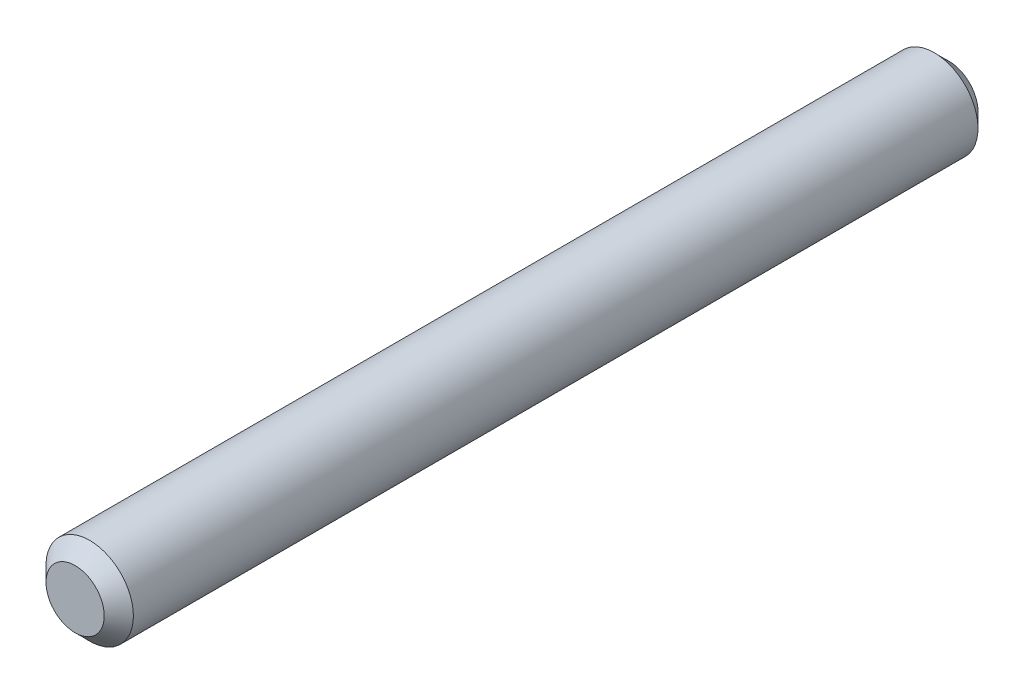
ISO-10303-21;
HEADER;
FILE_DESCRIPTION(('STEP AP214'),'2;1');
FILE_NAME('part.step','',(''),(''),'','','');
FILE_SCHEMA(('AUTOMOTIVE_DESIGN { 1 0 10303 214 1 1 1 1 }'));
ENDSEC;
DATA;
#1=APPLICATION_CONTEXT('core data for automotive mechanical design processes');
#2=APPLICATION_PROTOCOL_DEFINITION('international standard','automotive_design',2000,#1);
#3=PRODUCT_CONTEXT('',#1,'mechanical');
#4=PRODUCT('Part','Part','',(#3));
#5=PRODUCT_RELATED_PRODUCT_CATEGORY('part','',(#4));
#6=PRODUCT_DEFINITION_FORMATION('','',#4);
#7=PRODUCT_DEFINITION_CONTEXT('part definition',#1,'design');
#8=PRODUCT_DEFINITION('design','',#6,#7);
#9=PRODUCT_DEFINITION_SHAPE('','',#8);
#10=(LENGTH_UNIT() NAMED_UNIT(*) SI_UNIT(.MILLI.,.METRE.));
#11=(NAMED_UNIT(*) PLANE_ANGLE_UNIT() SI_UNIT($,.RADIAN.));
#12=(NAMED_UNIT(*) SI_UNIT($,.STERADIAN.) SOLID_ANGLE_UNIT());
#13=UNCERTAINTY_MEASURE_WITH_UNIT(LENGTH_MEASURE(1.E-05),#10,'distance_accuracy_value','');
#14=(GEOMETRIC_REPRESENTATION_CONTEXT(3) GLOBAL_UNCERTAINTY_ASSIGNED_CONTEXT((#13)) GLOBAL_UNIT_ASSIGNED_CONTEXT((#10,
#11,#12)) REPRESENTATION_CONTEXT('',''));
#15=CARTESIAN_POINT('',(0.,0.,0.));
#16=DIRECTION('',(0.,0.,1.));
#17=DIRECTION('',(1.,0.,0.));
#18=AXIS2_PLACEMENT_3D('',#15,#16,#17);
#19=CARTESIAN_POINT('',(0.,0.,15.));
#20=DIRECTION('',(0.,0.,-1.));
#21=DIRECTION('',(-1.,0.,0.));
#22=AXIS2_PLACEMENT_3D('',#19,#20,#21);
#23=CYLINDRICAL_SURFACE('',#22,1.5);
#24=CARTESIAN_POINT('',(0.,0.,-14.5));
#25=DIRECTION('',(0.,0.,1.));
#26=DIRECTION('',(1.,0.,0.));
#27=AXIS2_PLACEMENT_3D('',#24,#25,#26);
#28=CIRCLE('',#27,1.5);
#29=CARTESIAN_POINT('',(1.5,0.,-14.5));
#30=VERTEX_POINT('',#29);
#31=EDGE_CURVE('E41',#30,#30,#28,.T.);
#32=ORIENTED_EDGE('',*,*,#31,.T.);
#33=EDGE_LOOP('',(#32));
#34=FACE_BOUND('',#33,.T.);
#35=CARTESIAN_POINT('',(0.,0.,14.5));
#36=DIRECTION('',(0.,0.,1.));
#37=DIRECTION('',(1.,0.,0.));
#38=AXIS2_PLACEMENT_3D('',#35,#36,#37);
#39=CIRCLE('',#38,1.5);
#40=CARTESIAN_POINT('',(1.5,0.,14.5));
#41=VERTEX_POINT('',#40);
#42=EDGE_CURVE('E45',#41,#41,#39,.F.);
#43=ORIENTED_EDGE('',*,*,#42,.T.);
#44=EDGE_LOOP('',(#43));
#45=FACE_BOUND('',#44,.T.);
#46=ADVANCED_FACE('F30',(#34,#45),#23,.T.);
#47=CARTESIAN_POINT('',(0.,0.,15.));
#48=DIRECTION('',(0.,0.,1.));
#49=DIRECTION('',(1.,0.,0.));
#50=AXIS2_PLACEMENT_3D('',#47,#48,#49);
#51=PLANE('',#50);
#52=CARTESIAN_POINT('',(0.,0.,15.));
#53=DIRECTION('',(0.,0.,1.));
#54=DIRECTION('',(1.,0.,0.));
#55=AXIS2_PLACEMENT_3D('',#52,#53,#54);
#56=CIRCLE('',#55,1.);
#57=CARTESIAN_POINT('',(1.,0.,15.));
#58=VERTEX_POINT('',#57);
#59=EDGE_CURVE('E10',#58,#58,#56,.T.);
#60=ORIENTED_EDGE('',*,*,#59,.T.);
#61=EDGE_LOOP('',(#60));
#62=FACE_BOUND('',#61,.T.);
#63=ADVANCED_FACE('F61',(#62),#51,.T.);
#64=CARTESIAN_POINT('',(0.,0.,-15.));
#65=DIRECTION('',(0.,0.,1.));
#66=DIRECTION('',(1.,0.,0.));
#67=AXIS2_PLACEMENT_3D('',#64,#65,#66);
#68=PLANE('',#67);
#69=CARTESIAN_POINT('',(0.,0.,-15.));
#70=DIRECTION('',(0.,0.,1.));
#71=DIRECTION('',(1.,0.,0.));
#72=AXIS2_PLACEMENT_3D('',#69,#70,#71);
#73=CIRCLE('',#72,1.);
#74=CARTESIAN_POINT('',(1.,0.,-15.));
#75=VERTEX_POINT('',#74);
#76=EDGE_CURVE('E37',#75,#75,#73,.F.);
#77=ORIENTED_EDGE('',*,*,#76,.T.);
#78=EDGE_LOOP('',(#77));
#79=FACE_BOUND('',#78,.T.);
#80=ADVANCED_FACE('F58',(#79),#68,.F.);
#81=CARTESIAN_POINT('',(0.,0.,-14.5));
#82=DIRECTION('',(0.,0.,1.));
#83=DIRECTION('',(1.,0.,0.));
#84=AXIS2_PLACEMENT_3D('',#81,#82,#83);
#85=CONICAL_SURFACE('',#84,1.5,0.78539816339745);
#86=ORIENTED_EDGE('',*,*,#76,.F.);
#87=EDGE_LOOP('',(#86));
#88=FACE_BOUND('',#87,.T.);
#89=ORIENTED_EDGE('',*,*,#31,.F.);
#90=EDGE_LOOP('',(#89));
#91=FACE_BOUND('',#90,.T.);
#92=ADVANCED_FACE('F54',(#88,#91),#85,.T.);
#93=CARTESIAN_POINT('',(0.,0.,15.));
#94=DIRECTION('',(0.,0.,-1.));
#95=DIRECTION('',(-1.,0.,0.));
#96=AXIS2_PLACEMENT_3D('',#93,#94,#95);
#97=CONICAL_SURFACE('',#96,1.,0.78539816339745);
#98=ORIENTED_EDGE('',*,*,#42,.F.);
#99=EDGE_LOOP('',(#98));
#100=FACE_BOUND('',#99,.T.);
#101=ORIENTED_EDGE('',*,*,#59,.F.);
#102=EDGE_LOOP('',(#101));
#103=FACE_BOUND('',#102,.T.);
#104=ADVANCED_FACE('F32',(#100,#103),#97,.T.);
#105=CLOSED_SHELL('',(#46,#63,#80,#92,#104));
#106=MANIFOLD_SOLID_BREP('B2',#105);
#107=ADVANCED_BREP_SHAPE_REPRESENTATION('',(#18,#106),#14);
#108=SHAPE_DEFINITION_REPRESENTATION(#9,#107);
ENDSEC;
END-ISO-10303-21;
